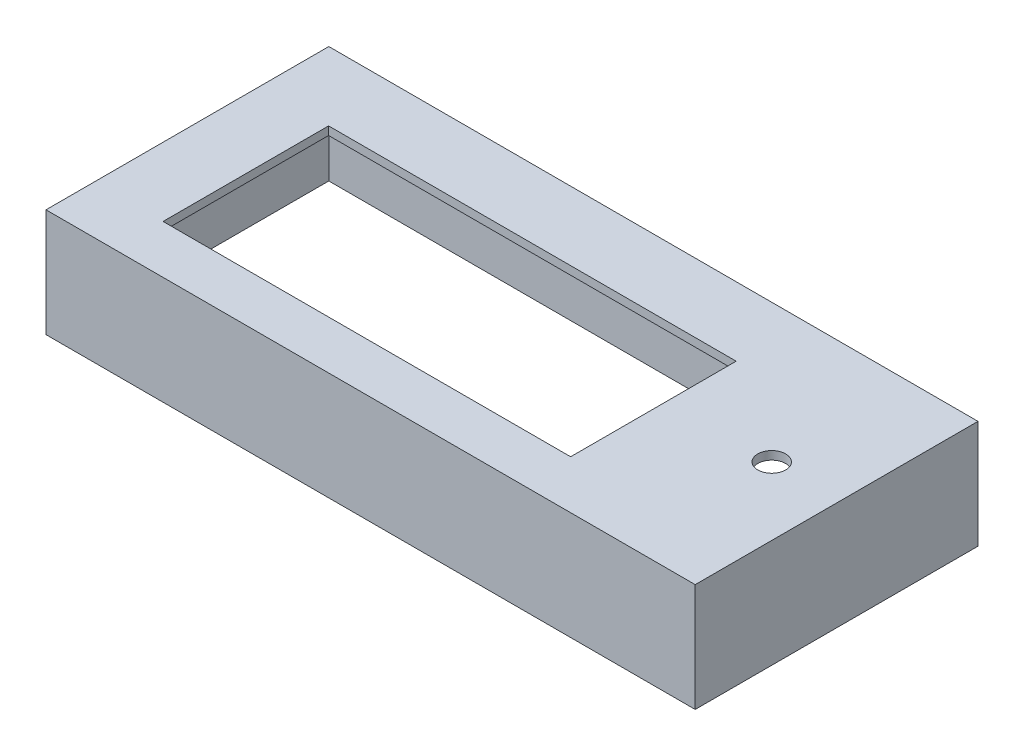
ISO-10303-21;
HEADER;
FILE_DESCRIPTION(('STEP AP214'),'2;1');
FILE_NAME('part.step','',(''),(''),'','','');
FILE_SCHEMA(('AUTOMOTIVE_DESIGN { 1 0 10303 214 1 1 1 1 }'));
ENDSEC;
DATA;
#1=APPLICATION_CONTEXT('core data for automotive mechanical design processes');
#2=APPLICATION_PROTOCOL_DEFINITION('international standard','automotive_design',2000,#1);
#3=PRODUCT_CONTEXT('',#1,'mechanical');
#4=PRODUCT('Part','Part','',(#3));
#5=PRODUCT_RELATED_PRODUCT_CATEGORY('part','',(#4));
#6=PRODUCT_DEFINITION_FORMATION('','',#4);
#7=PRODUCT_DEFINITION_CONTEXT('part definition',#1,'design');
#8=PRODUCT_DEFINITION('design','',#6,#7);
#9=PRODUCT_DEFINITION_SHAPE('','',#8);
#10=(LENGTH_UNIT() NAMED_UNIT(*) SI_UNIT(.MILLI.,.METRE.));
#11=(NAMED_UNIT(*) PLANE_ANGLE_UNIT() SI_UNIT($,.RADIAN.));
#12=(NAMED_UNIT(*) SI_UNIT($,.STERADIAN.) SOLID_ANGLE_UNIT());
#13=UNCERTAINTY_MEASURE_WITH_UNIT(LENGTH_MEASURE(1.E-05),#10,'distance_accuracy_value','');
#14=(GEOMETRIC_REPRESENTATION_CONTEXT(3) GLOBAL_UNCERTAINTY_ASSIGNED_CONTEXT((#13)) GLOBAL_UNIT_ASSIGNED_CONTEXT((#10,
#11,#12)) REPRESENTATION_CONTEXT('',''));
#15=CARTESIAN_POINT('',(0.,0.,0.));
#16=DIRECTION('',(0.,0.,1.));
#17=DIRECTION('',(1.,0.,0.));
#18=AXIS2_PLACEMENT_3D('',#15,#16,#17);
#19=CARTESIAN_POINT('',(78.05,2.,34.));
#20=DIRECTION('',(-1.,0.,0.));
#21=DIRECTION('',(0.,0.,1.));
#22=AXIS2_PLACEMENT_3D('',#19,#20,#21);
#23=PLANE('',#22);
#24=DIRECTION('',(0.,-1.,0.));
#25=VECTOR('',#24,1.);
#26=CARTESIAN_POINT('',(78.05,2.,34.));
#27=LINE('',#26,#25);
#28=CARTESIAN_POINT('',(78.05,2.,34.));
#29=VERTEX_POINT('',#28);
#30=CARTESIAN_POINT('',(78.05,-24.,34.));
#31=VERTEX_POINT('',#30);
#32=EDGE_CURVE('E205',#29,#31,#27,.T.);
#33=ORIENTED_EDGE('',*,*,#32,.T.);
#34=DIRECTION('',(0.,0.,1.));
#35=VECTOR('',#34,1.);
#36=CARTESIAN_POINT('',(78.05,-24.,-34.));
#37=LINE('',#36,#35);
#38=CARTESIAN_POINT('',(78.05,-24.,-34.));
#39=VERTEX_POINT('',#38);
#40=EDGE_CURVE('E163',#39,#31,#37,.T.);
#41=ORIENTED_EDGE('',*,*,#40,.F.);
#42=DIRECTION('',(0.,-1.,0.));
#43=VECTOR('',#42,1.);
#44=CARTESIAN_POINT('',(78.05,2.,-34.));
#45=LINE('',#44,#43);
#46=CARTESIAN_POINT('',(78.05,2.,-34.));
#47=VERTEX_POINT('',#46);
#48=EDGE_CURVE('E211',#47,#39,#45,.T.);
#49=ORIENTED_EDGE('',*,*,#48,.F.);
#50=DIRECTION('',(0.,0.,-1.));
#51=VECTOR('',#50,1.);
#52=CARTESIAN_POINT('',(78.05,2.,34.));
#53=LINE('',#52,#51);
#54=EDGE_CURVE('E196',#29,#47,#53,.T.);
#55=ORIENTED_EDGE('',*,*,#54,.F.);
#56=EDGE_LOOP('',(#33,#41,#49,#55));
#57=FACE_BOUND('',#56,.T.);
#58=ADVANCED_FACE('F37',(#57),#23,.F.);
#59=CARTESIAN_POINT('',(-78.05,2.,-34.));
#60=DIRECTION('',(0.,0.,1.));
#61=DIRECTION('',(1.,0.,0.));
#62=AXIS2_PLACEMENT_3D('',#59,#60,#61);
#63=PLANE('',#62);
#64=ORIENTED_EDGE('',*,*,#48,.T.);
#65=DIRECTION('',(1.,0.,0.));
#66=VECTOR('',#65,1.);
#67=CARTESIAN_POINT('',(-78.05,-24.,-34.));
#68=LINE('',#67,#66);
#69=CARTESIAN_POINT('',(-78.05,-24.,-34.));
#70=VERTEX_POINT('',#69);
#71=EDGE_CURVE('E139',#70,#39,#68,.T.);
#72=ORIENTED_EDGE('',*,*,#71,.F.);
#73=DIRECTION('',(0.,-1.,0.));
#74=VECTOR('',#73,1.);
#75=CARTESIAN_POINT('',(-78.05,2.,-34.));
#76=LINE('',#75,#74);
#77=CARTESIAN_POINT('',(-78.05,2.,-34.));
#78=VERTEX_POINT('',#77);
#79=EDGE_CURVE('E209',#78,#70,#76,.T.);
#80=ORIENTED_EDGE('',*,*,#79,.F.);
#81=DIRECTION('',(-1.,0.,0.));
#82=VECTOR('',#81,1.);
#83=CARTESIAN_POINT('',(-78.05,2.,-34.));
#84=LINE('',#83,#82);
#85=EDGE_CURVE('E199',#47,#78,#84,.T.);
#86=ORIENTED_EDGE('',*,*,#85,.F.);
#87=EDGE_LOOP('',(#64,#72,#80,#86));
#88=FACE_BOUND('',#87,.T.);
#89=ADVANCED_FACE('F254',(#88),#63,.F.);
#90=CARTESIAN_POINT('',(-78.05,2.,34.));
#91=DIRECTION('',(1.,0.,0.));
#92=DIRECTION('',(0.,0.,-1.));
#93=AXIS2_PLACEMENT_3D('',#90,#91,#92);
#94=PLANE('',#93);
#95=ORIENTED_EDGE('',*,*,#79,.T.);
#96=DIRECTION('',(0.,0.,-1.));
#97=VECTOR('',#96,1.);
#98=CARTESIAN_POINT('',(-78.05,-24.,34.));
#99=LINE('',#98,#97);
#100=CARTESIAN_POINT('',(-78.05,-24.,34.));
#101=VERTEX_POINT('',#100);
#102=EDGE_CURVE('E169',#101,#70,#99,.T.);
#103=ORIENTED_EDGE('',*,*,#102,.F.);
#104=DIRECTION('',(0.,-1.,0.));
#105=VECTOR('',#104,1.);
#106=CARTESIAN_POINT('',(-78.05,2.,34.));
#107=LINE('',#106,#105);
#108=CARTESIAN_POINT('',(-78.05,2.,34.));
#109=VERTEX_POINT('',#108);
#110=EDGE_CURVE('E207',#109,#101,#107,.T.);
#111=ORIENTED_EDGE('',*,*,#110,.F.);
#112=DIRECTION('',(0.,0.,1.));
#113=VECTOR('',#112,1.);
#114=CARTESIAN_POINT('',(-78.05,2.,34.));
#115=LINE('',#114,#113);
#116=EDGE_CURVE('E201',#78,#109,#115,.T.);
#117=ORIENTED_EDGE('',*,*,#116,.F.);
#118=EDGE_LOOP('',(#95,#103,#111,#117));
#119=FACE_BOUND('',#118,.T.);
#120=ADVANCED_FACE('F259',(#119),#94,.F.);
#121=CARTESIAN_POINT('',(-78.05,2.,34.));
#122=DIRECTION('',(0.,0.,-1.));
#123=DIRECTION('',(-1.,0.,0.));
#124=AXIS2_PLACEMENT_3D('',#121,#122,#123);
#125=PLANE('',#124);
#126=ORIENTED_EDGE('',*,*,#110,.T.);
#127=DIRECTION('',(-1.,0.,0.));
#128=VECTOR('',#127,1.);
#129=CARTESIAN_POINT('',(78.05,-24.,34.));
#130=LINE('',#129,#128);
#131=EDGE_CURVE('E166',#31,#101,#130,.T.);
#132=ORIENTED_EDGE('',*,*,#131,.F.);
#133=ORIENTED_EDGE('',*,*,#32,.F.);
#134=DIRECTION('',(1.,0.,0.));
#135=VECTOR('',#134,1.);
#136=CARTESIAN_POINT('',(-78.05,2.,34.));
#137=LINE('',#136,#135);
#138=EDGE_CURVE('E203',#109,#29,#137,.T.);
#139=ORIENTED_EDGE('',*,*,#138,.F.);
#140=EDGE_LOOP('',(#126,#132,#133,#139));
#141=FACE_BOUND('',#140,.T.);
#142=ADVANCED_FACE('F270',(#141),#125,.F.);
#143=CARTESIAN_POINT('',(0.,2.,0.));
#144=DIRECTION('',(0.,-1.,0.));
#145=DIRECTION('',(0.,0.,-1.));
#146=AXIS2_PLACEMENT_3D('',#143,#144,#145);
#147=PLANE('',#146);
#148=DIRECTION('',(1.,0.,0.));
#149=VECTOR('',#148,1.);
#150=CARTESIAN_POINT('',(0.,2.,22.35));
#151=LINE('',#150,#149);
#152=CARTESIAN_POINT('',(-61.55,2.,22.35));
#153=VERTEX_POINT('',#152);
#154=CARTESIAN_POINT('',(36.45,2.,22.35));
#155=VERTEX_POINT('',#154);
#156=EDGE_CURVE('E189',#153,#155,#151,.T.);
#157=ORIENTED_EDGE('',*,*,#156,.F.);
#158=DIRECTION('',(0.,0.,1.));
#159=VECTOR('',#158,1.);
#160=CARTESIAN_POINT('',(-61.55,2.,0.));
#161=LINE('',#160,#159);
#162=CARTESIAN_POINT('',(-61.55,2.,-17.45));
#163=VERTEX_POINT('',#162);
#164=EDGE_CURVE('E194',#163,#153,#161,.T.);
#165=ORIENTED_EDGE('',*,*,#164,.F.);
#166=DIRECTION('',(-1.,0.,0.));
#167=VECTOR('',#166,1.);
#168=CARTESIAN_POINT('',(0.,2.,-17.45));
#169=LINE('',#168,#167);
#170=CARTESIAN_POINT('',(36.45,2.,-17.45));
#171=VERTEX_POINT('',#170);
#172=EDGE_CURVE('E187',#171,#163,#169,.T.);
#173=ORIENTED_EDGE('',*,*,#172,.F.);
#174=DIRECTION('',(0.,0.,-1.));
#175=VECTOR('',#174,1.);
#176=CARTESIAN_POINT('',(36.45,2.,0.));
#177=LINE('',#176,#175);
#178=EDGE_CURVE('E191',#155,#171,#177,.T.);
#179=ORIENTED_EDGE('',*,*,#178,.F.);
#180=EDGE_LOOP('',(#157,#165,#173,#179));
#181=FACE_BOUND('',#180,.T.);
#182=CARTESIAN_POINT('',(61.7,2.,-0.749999999999999));
#183=DIRECTION('',(0.,-1.,0.));
#184=DIRECTION('',(0.,0.,-1.));
#185=AXIS2_PLACEMENT_3D('',#182,#183,#184);
#186=CIRCLE('',#185,3.34999999999999);
#187=CARTESIAN_POINT('',(61.7,2.,-4.09999999999999));
#188=VERTEX_POINT('',#187);
#189=EDGE_CURVE('E184',#188,#188,#186,.F.);
#190=ORIENTED_EDGE('',*,*,#189,.F.);
#191=EDGE_LOOP('',(#190));
#192=FACE_BOUND('',#191,.T.);
#193=ORIENTED_EDGE('',*,*,#54,.T.);
#194=ORIENTED_EDGE('',*,*,#85,.T.);
#195=ORIENTED_EDGE('',*,*,#116,.T.);
#196=ORIENTED_EDGE('',*,*,#138,.T.);
#197=EDGE_LOOP('',(#193,#194,#195,#196));
#198=FACE_BOUND('',#197,.T.);
#199=ADVANCED_FACE('F236',(#181,#192,#198),#147,.F.);
#200=CARTESIAN_POINT('',(0.,0.,0.));
#201=DIRECTION('',(0.,-1.,0.));
#202=DIRECTION('',(0.,0.,-1.));
#203=AXIS2_PLACEMENT_3D('',#200,#201,#202);
#204=PLANE('',#203);
#205=DIRECTION('',(1.,0.,0.));
#206=VECTOR('',#205,1.);
#207=CARTESIAN_POINT('',(-76.05,0.,-32.));
#208=LINE('',#207,#206);
#209=CARTESIAN_POINT('',(-76.05,0.,-32.));
#210=VERTEX_POINT('',#209);
#211=CARTESIAN_POINT('',(76.05,0.,-32.));
#212=VERTEX_POINT('',#211);
#213=EDGE_CURVE('E51',#210,#212,#208,.T.);
#214=ORIENTED_EDGE('',*,*,#213,.T.);
#215=DIRECTION('',(0.,0.,1.));
#216=VECTOR('',#215,1.);
#217=CARTESIAN_POINT('',(76.05,0.,-32.));
#218=LINE('',#217,#216);
#219=CARTESIAN_POINT('',(76.05,0.,32.));
#220=VERTEX_POINT('',#219);
#221=EDGE_CURVE('E55',#212,#220,#218,.T.);
#222=ORIENTED_EDGE('',*,*,#221,.T.);
#223=DIRECTION('',(-1.,0.,0.));
#224=VECTOR('',#223,1.);
#225=CARTESIAN_POINT('',(76.05,0.,32.));
#226=LINE('',#225,#224);
#227=CARTESIAN_POINT('',(-76.05,0.,32.));
#228=VERTEX_POINT('',#227);
#229=EDGE_CURVE('E153',#220,#228,#226,.T.);
#230=ORIENTED_EDGE('',*,*,#229,.T.);
#231=DIRECTION('',(0.,0.,-1.));
#232=VECTOR('',#231,1.);
#233=CARTESIAN_POINT('',(-76.05,0.,32.));
#234=LINE('',#233,#232);
#235=EDGE_CURVE('E134',#228,#210,#234,.T.);
#236=ORIENTED_EDGE('',*,*,#235,.T.);
#237=EDGE_LOOP('',(#214,#222,#230,#236));
#238=FACE_BOUND('',#237,.T.);
#239=DIRECTION('',(0.,0.,1.));
#240=VECTOR('',#239,1.);
#241=CARTESIAN_POINT('',(-61.55,0.,0.));
#242=LINE('',#241,#240);
#243=CARTESIAN_POINT('',(-61.55,0.,-17.45));
#244=VERTEX_POINT('',#243);
#245=CARTESIAN_POINT('',(-61.55,0.,22.35));
#246=VERTEX_POINT('',#245);
#247=EDGE_CURVE('E44',#244,#246,#242,.T.);
#248=ORIENTED_EDGE('',*,*,#247,.T.);
#249=DIRECTION('',(1.,0.,0.));
#250=VECTOR('',#249,1.);
#251=CARTESIAN_POINT('',(0.,0.,22.35));
#252=LINE('',#251,#250);
#253=CARTESIAN_POINT('',(36.45,0.,22.35));
#254=VERTEX_POINT('',#253);
#255=EDGE_CURVE('E11',#246,#254,#252,.T.);
#256=ORIENTED_EDGE('',*,*,#255,.T.);
#257=DIRECTION('',(0.,0.,-1.));
#258=VECTOR('',#257,1.);
#259=CARTESIAN_POINT('',(36.45,0.,0.));
#260=LINE('',#259,#258);
#261=CARTESIAN_POINT('',(36.45,0.,-17.45));
#262=VERTEX_POINT('',#261);
#263=EDGE_CURVE('E218',#254,#262,#260,.T.);
#264=ORIENTED_EDGE('',*,*,#263,.T.);
#265=DIRECTION('',(-1.,0.,0.));
#266=VECTOR('',#265,1.);
#267=CARTESIAN_POINT('',(0.,0.,-17.45));
#268=LINE('',#267,#266);
#269=EDGE_CURVE('E213',#262,#244,#268,.T.);
#270=ORIENTED_EDGE('',*,*,#269,.T.);
#271=EDGE_LOOP('',(#248,#256,#264,#270));
#272=FACE_BOUND('',#271,.T.);
#273=CARTESIAN_POINT('',(61.7,0.,-0.749999999999999));
#274=DIRECTION('',(0.,-1.,0.));
#275=DIRECTION('',(0.,0.,-1.));
#276=AXIS2_PLACEMENT_3D('',#273,#274,#275);
#277=CIRCLE('',#276,3.34999999999999);
#278=CARTESIAN_POINT('',(61.7,0.,-4.09999999999999));
#279=VERTEX_POINT('',#278);
#280=EDGE_CURVE('E183',#279,#279,#277,.F.);
#281=ORIENTED_EDGE('',*,*,#280,.T.);
#282=EDGE_LOOP('',(#281));
#283=FACE_BOUND('',#282,.T.);
#284=ADVANCED_FACE('F223',(#238,#272,#283),#204,.T.);
#285=CARTESIAN_POINT('',(61.7,4.8,-0.749999999999999));
#286=DIRECTION('',(0.,-1.,0.));
#287=DIRECTION('',(0.,0.,-1.));
#288=AXIS2_PLACEMENT_3D('',#285,#286,#287);
#289=CYLINDRICAL_SURFACE('',#288,3.34999999999999);
#290=CARTESIAN_POINT('',(61.7,0.,-4.09999999999999));
#291=CARTESIAN_POINT('',(61.7,0.0208333333333342,-4.09999999999999));
#292=CARTESIAN_POINT('',(61.7,0.0416666666666676,-4.09999999999999));
#293=CARTESIAN_POINT('',(61.7,0.0833333333333343,-4.09999999999999));
#294=CARTESIAN_POINT('',(61.7,0.104166666666668,-4.09999999999999));
#295=CARTESIAN_POINT('',(61.7,0.145833333333334,-4.09999999999999));
#296=CARTESIAN_POINT('',(61.7,0.166666666666668,-4.09999999999999));
#297=CARTESIAN_POINT('',(61.7,0.208333333333334,-4.09999999999999));
#298=CARTESIAN_POINT('',(61.7,0.229166666666668,-4.09999999999999));
#299=CARTESIAN_POINT('',(61.7,0.270833333333334,-4.09999999999999));
#300=CARTESIAN_POINT('',(61.7,0.291666666666668,-4.09999999999999));
#301=CARTESIAN_POINT('',(61.7,0.333333333333335,-4.09999999999999));
#302=CARTESIAN_POINT('',(61.7,0.354166666666668,-4.09999999999999));
#303=CARTESIAN_POINT('',(61.7,0.395833333333335,-4.09999999999999));
#304=CARTESIAN_POINT('',(61.7,0.416666666666668,-4.09999999999999));
#305=CARTESIAN_POINT('',(61.7,0.458333333333335,-4.09999999999999));
#306=CARTESIAN_POINT('',(61.7,0.479166666666668,-4.09999999999999));
#307=CARTESIAN_POINT('',(61.7,0.520833333333335,-4.09999999999999));
#308=CARTESIAN_POINT('',(61.7,0.541666666666668,-4.09999999999999));
#309=CARTESIAN_POINT('',(61.7,0.583333333333334,-4.09999999999999));
#310=CARTESIAN_POINT('',(61.7,0.604166666666667,-4.09999999999999));
#311=CARTESIAN_POINT('',(61.7,0.645833333333334,-4.09999999999999));
#312=CARTESIAN_POINT('',(61.7,0.666666666666667,-4.09999999999999));
#313=CARTESIAN_POINT('',(61.7,0.708333333333334,-4.09999999999999));
#314=CARTESIAN_POINT('',(61.7,0.729166666666667,-4.09999999999999));
#315=CARTESIAN_POINT('',(61.7,0.770833333333334,-4.09999999999999));
#316=CARTESIAN_POINT('',(61.7,0.791666666666667,-4.09999999999999));
#317=CARTESIAN_POINT('',(61.7,0.833333333333334,-4.09999999999999));
#318=CARTESIAN_POINT('',(61.7,0.854166666666667,-4.09999999999999));
#319=CARTESIAN_POINT('',(61.7,0.895833333333334,-4.09999999999999));
#320=CARTESIAN_POINT('',(61.7,0.916666666666667,-4.09999999999999));
#321=CARTESIAN_POINT('',(61.7,0.958333333333334,-4.09999999999999));
#322=CARTESIAN_POINT('',(61.7,0.979166666666667,-4.09999999999999));
#323=CARTESIAN_POINT('',(61.7,1.02083333333333,-4.09999999999999));
#324=CARTESIAN_POINT('',(61.7,1.04166666666667,-4.09999999999999));
#325=CARTESIAN_POINT('',(61.7,1.08333333333333,-4.09999999999999));
#326=CARTESIAN_POINT('',(61.7,1.10416666666667,-4.09999999999999));
#327=CARTESIAN_POINT('',(61.7,1.14583333333333,-4.09999999999999));
#328=CARTESIAN_POINT('',(61.7,1.16666666666667,-4.09999999999999));
#329=CARTESIAN_POINT('',(61.7,1.20833333333333,-4.09999999999999));
#330=CARTESIAN_POINT('',(61.7,1.22916666666667,-4.09999999999999));
#331=CARTESIAN_POINT('',(61.7,1.27083333333333,-4.09999999999999));
#332=CARTESIAN_POINT('',(61.7,1.29166666666667,-4.09999999999999));
#333=CARTESIAN_POINT('',(61.7,1.33333333333333,-4.09999999999999));
#334=CARTESIAN_POINT('',(61.7,1.35416666666667,-4.09999999999999));
#335=CARTESIAN_POINT('',(61.7,1.39583333333333,-4.09999999999999));
#336=CARTESIAN_POINT('',(61.7,1.41666666666667,-4.09999999999999));
#337=CARTESIAN_POINT('',(61.7,1.45833333333333,-4.09999999999999));
#338=CARTESIAN_POINT('',(61.7,1.47916666666667,-4.09999999999999));
#339=CARTESIAN_POINT('',(61.7,1.52083333333333,-4.09999999999999));
#340=CARTESIAN_POINT('',(61.7,1.54166666666667,-4.09999999999999));
#341=CARTESIAN_POINT('',(61.7,1.58333333333333,-4.09999999999999));
#342=CARTESIAN_POINT('',(61.7,1.60416666666667,-4.09999999999999));
#343=CARTESIAN_POINT('',(61.7,1.64583333333333,-4.09999999999999));
#344=CARTESIAN_POINT('',(61.7,1.66666666666667,-4.09999999999999));
#345=CARTESIAN_POINT('',(61.7,1.70833333333333,-4.09999999999999));
#346=CARTESIAN_POINT('',(61.7,1.72916666666667,-4.09999999999999));
#347=CARTESIAN_POINT('',(61.7,1.77083333333333,-4.09999999999999));
#348=CARTESIAN_POINT('',(61.7,1.79166666666667,-4.09999999999999));
#349=CARTESIAN_POINT('',(61.7,1.83333333333333,-4.09999999999999));
#350=CARTESIAN_POINT('',(61.7,1.85416666666667,-4.09999999999999));
#351=CARTESIAN_POINT('',(61.7,1.89583333333333,-4.09999999999999));
#352=CARTESIAN_POINT('',(61.7,1.91666666666667,-4.09999999999999));
#353=CARTESIAN_POINT('',(61.7,1.95833333333333,-4.09999999999999));
#354=CARTESIAN_POINT('',(61.7,1.97916666666667,-4.09999999999999));
#355=CARTESIAN_POINT('',(61.7,2.,-4.09999999999999));
#356=B_SPLINE_CURVE_WITH_KNOTS('',3,(#290,#291,#292,#293,#294,#295,#296,#297,#298,#299,#300,
#301,#302,#303,#304,#305,#306,#307,#308,#309,#310,#311,#312,#313,#314,#315,#316,#317,#318,#319,
#320,#321,#322,#323,#324,#325,#326,#327,#328,#329,#330,#331,#332,#333,#334,#335,#336,#337,#338,
#339,#340,#341,#342,#343,#344,#345,#346,#347,#348,#349,#350,#351,#352,#353,#354,#355),
.UNSPECIFIED.,.F.,.F.,(4,2,2,2,2,2,2,2,2,2,2,2,2,2,2,2,2,2,2,2,2,2,2,2,2,2,2,2,2,2,2,2,4),(0.,
0.0625000000000001,0.125,0.1875,0.25,0.3125,0.375,0.4375,0.5,0.5625,0.625,0.6875,0.75,0.8125,
0.875,0.9375,1.,1.0625,1.125,1.1875,1.25,1.3125,1.375,1.4375,1.5,1.5625,1.625,1.6875,1.75,
1.8125,1.875,1.9375,2.),.UNSPECIFIED.);
#357=EDGE_CURVE('BSEAM282',#279,#188,#356,.T.);
#358=ORIENTED_EDGE('',*,*,#280,.F.);
#359=ORIENTED_EDGE('',*,*,#189,.T.);
#360=ORIENTED_EDGE('',*,*,#357,.T.);
#361=ORIENTED_EDGE('',*,*,#357,.F.);
#362=EDGE_LOOP('',(#358,#360,#359,#361));
#363=FACE_BOUND('',#362,.T.);
#364=ADVANCED_FACE('F282',(#363),#289,.F.);
#365=CARTESIAN_POINT('',(-61.55,-5.,-27.55));
#366=DIRECTION('',(1.,0.,0.));
#367=DIRECTION('',(0.,0.,-1.));
#368=AXIS2_PLACEMENT_3D('',#365,#366,#367);
#369=PLANE('',#368);
#370=ORIENTED_EDGE('',*,*,#164,.T.);
#371=DIRECTION('',(0.,-1.,0.));
#372=VECTOR('',#371,1.);
#373=CARTESIAN_POINT('',(-61.55,5.,22.35));
#374=LINE('',#373,#372);
#375=EDGE_CURVE('E180',#153,#246,#374,.T.);
#376=ORIENTED_EDGE('',*,*,#375,.T.);
#377=ORIENTED_EDGE('',*,*,#247,.F.);
#378=DIRECTION('',(0.,-1.,0.));
#379=VECTOR('',#378,1.);
#380=CARTESIAN_POINT('',(-61.55,5.,-17.45));
#381=LINE('',#380,#379);
#382=EDGE_CURVE('E172',#163,#244,#381,.T.);
#383=ORIENTED_EDGE('',*,*,#382,.F.);
#384=EDGE_LOOP('',(#370,#376,#377,#383));
#385=FACE_BOUND('',#384,.T.);
#386=ADVANCED_FACE('F227',(#385),#369,.T.);
#387=CARTESIAN_POINT('',(36.45,-5.,-27.55));
#388=DIRECTION('',(-1.,0.,0.));
#389=DIRECTION('',(0.,0.,1.));
#390=AXIS2_PLACEMENT_3D('',#387,#388,#389);
#391=PLANE('',#390);
#392=ORIENTED_EDGE('',*,*,#178,.T.);
#393=DIRECTION('',(0.,-1.,0.));
#394=VECTOR('',#393,1.);
#395=CARTESIAN_POINT('',(36.45,5.,-17.45));
#396=LINE('',#395,#394);
#397=EDGE_CURVE('E174',#171,#262,#396,.T.);
#398=ORIENTED_EDGE('',*,*,#397,.T.);
#399=ORIENTED_EDGE('',*,*,#263,.F.);
#400=DIRECTION('',(0.,-1.,0.));
#401=VECTOR('',#400,1.);
#402=CARTESIAN_POINT('',(36.45,5.,22.35));
#403=LINE('',#402,#401);
#404=EDGE_CURVE('E177',#155,#254,#403,.T.);
#405=ORIENTED_EDGE('',*,*,#404,.F.);
#406=EDGE_LOOP('',(#392,#398,#399,#405));
#407=FACE_BOUND('',#406,.T.);
#408=ADVANCED_FACE('F240',(#407),#391,.T.);
#409=CARTESIAN_POINT('',(-61.55,5.,22.35));
#410=DIRECTION('',(0.,0.,-1.));
#411=DIRECTION('',(-1.,0.,0.));
#412=AXIS2_PLACEMENT_3D('',#409,#410,#411);
#413=PLANE('',#412);
#414=ORIENTED_EDGE('',*,*,#156,.T.);
#415=ORIENTED_EDGE('',*,*,#404,.T.);
#416=ORIENTED_EDGE('',*,*,#255,.F.);
#417=ORIENTED_EDGE('',*,*,#375,.F.);
#418=EDGE_LOOP('',(#414,#415,#416,#417));
#419=FACE_BOUND('',#418,.T.);
#420=ADVANCED_FACE('F232',(#419),#413,.T.);
#421=CARTESIAN_POINT('',(-61.55,5.,-17.45));
#422=DIRECTION('',(0.,0.,1.));
#423=DIRECTION('',(1.,0.,0.));
#424=AXIS2_PLACEMENT_3D('',#421,#422,#423);
#425=PLANE('',#424);
#426=ORIENTED_EDGE('',*,*,#172,.T.);
#427=ORIENTED_EDGE('',*,*,#382,.T.);
#428=ORIENTED_EDGE('',*,*,#269,.F.);
#429=ORIENTED_EDGE('',*,*,#397,.F.);
#430=EDGE_LOOP('',(#426,#427,#428,#429));
#431=FACE_BOUND('',#430,.T.);
#432=ADVANCED_FACE('F242',(#431),#425,.T.);
#433=CARTESIAN_POINT('',(0.,-24.,0.));
#434=DIRECTION('',(0.,-1.,0.));
#435=DIRECTION('',(0.,0.,-1.));
#436=AXIS2_PLACEMENT_3D('',#433,#434,#435);
#437=PLANE('',#436);
#438=ORIENTED_EDGE('',*,*,#71,.T.);
#439=ORIENTED_EDGE('',*,*,#40,.T.);
#440=ORIENTED_EDGE('',*,*,#131,.T.);
#441=ORIENTED_EDGE('',*,*,#102,.T.);
#442=EDGE_LOOP('',(#438,#439,#440,#441));
#443=FACE_BOUND('',#442,.T.);
#444=DIRECTION('',(0.,0.,1.));
#445=VECTOR('',#444,1.);
#446=CARTESIAN_POINT('',(76.05,-24.,-32.));
#447=LINE('',#446,#445);
#448=CARTESIAN_POINT('',(76.05,-24.,-32.));
#449=VERTEX_POINT('',#448);
#450=CARTESIAN_POINT('',(76.05,-24.,32.));
#451=VERTEX_POINT('',#450);
#452=EDGE_CURVE('E133',#449,#451,#447,.T.);
#453=ORIENTED_EDGE('',*,*,#452,.F.);
#454=DIRECTION('',(1.,0.,0.));
#455=VECTOR('',#454,1.);
#456=CARTESIAN_POINT('',(-76.05,-24.,-32.));
#457=LINE('',#456,#455);
#458=CARTESIAN_POINT('',(-76.05,-24.,-32.));
#459=VERTEX_POINT('',#458);
#460=EDGE_CURVE('E124',#459,#449,#457,.T.);
#461=ORIENTED_EDGE('',*,*,#460,.F.);
#462=DIRECTION('',(0.,0.,-1.));
#463=VECTOR('',#462,1.);
#464=CARTESIAN_POINT('',(-76.05,-24.,32.));
#465=LINE('',#464,#463);
#466=CARTESIAN_POINT('',(-76.05,-24.,32.));
#467=VERTEX_POINT('',#466);
#468=EDGE_CURVE('E147',#467,#459,#465,.T.);
#469=ORIENTED_EDGE('',*,*,#468,.F.);
#470=DIRECTION('',(-1.,0.,0.));
#471=VECTOR('',#470,1.);
#472=CARTESIAN_POINT('',(76.05,-24.,32.));
#473=LINE('',#472,#471);
#474=EDGE_CURVE('E145',#451,#467,#473,.T.);
#475=ORIENTED_EDGE('',*,*,#474,.F.);
#476=EDGE_LOOP('',(#453,#461,#469,#475));
#477=FACE_BOUND('',#476,.T.);
#478=ADVANCED_FACE('F143',(#443,#477),#437,.T.);
#479=CARTESIAN_POINT('',(-76.05,-24.,-32.));
#480=DIRECTION('',(0.,0.,1.));
#481=DIRECTION('',(1.,0.,0.));
#482=AXIS2_PLACEMENT_3D('',#479,#480,#481);
#483=PLANE('',#482);
#484=ORIENTED_EDGE('',*,*,#213,.F.);
#485=DIRECTION('',(0.,1.,0.));
#486=VECTOR('',#485,1.);
#487=CARTESIAN_POINT('',(-76.05,-24.,-32.));
#488=LINE('',#487,#486);
#489=EDGE_CURVE('E129',#459,#210,#488,.T.);
#490=ORIENTED_EDGE('',*,*,#489,.F.);
#491=ORIENTED_EDGE('',*,*,#460,.T.);
#492=DIRECTION('',(0.,1.,0.));
#493=VECTOR('',#492,1.);
#494=CARTESIAN_POINT('',(76.05,-24.,-32.));
#495=LINE('',#494,#493);
#496=EDGE_CURVE('E127',#449,#212,#495,.T.);
#497=ORIENTED_EDGE('',*,*,#496,.T.);
#498=EDGE_LOOP('',(#484,#490,#491,#497));
#499=FACE_BOUND('',#498,.T.);
#500=ADVANCED_FACE('F126',(#499),#483,.T.);
#501=CARTESIAN_POINT('',(76.05,-24.,-32.));
#502=DIRECTION('',(-1.,0.,0.));
#503=DIRECTION('',(0.,0.,1.));
#504=AXIS2_PLACEMENT_3D('',#501,#502,#503);
#505=PLANE('',#504);
#506=ORIENTED_EDGE('',*,*,#221,.F.);
#507=ORIENTED_EDGE('',*,*,#496,.F.);
#508=ORIENTED_EDGE('',*,*,#452,.T.);
#509=DIRECTION('',(0.,1.,0.));
#510=VECTOR('',#509,1.);
#511=CARTESIAN_POINT('',(76.05,-24.,32.));
#512=LINE('',#511,#510);
#513=EDGE_CURVE('E140',#451,#220,#512,.T.);
#514=ORIENTED_EDGE('',*,*,#513,.T.);
#515=EDGE_LOOP('',(#506,#507,#508,#514));
#516=FACE_BOUND('',#515,.T.);
#517=ADVANCED_FACE('F137',(#516),#505,.T.);
#518=CARTESIAN_POINT('',(76.05,-24.,32.));
#519=DIRECTION('',(0.,0.,-1.));
#520=DIRECTION('',(-1.,0.,0.));
#521=AXIS2_PLACEMENT_3D('',#518,#519,#520);
#522=PLANE('',#521);
#523=ORIENTED_EDGE('',*,*,#229,.F.);
#524=ORIENTED_EDGE('',*,*,#513,.F.);
#525=ORIENTED_EDGE('',*,*,#474,.T.);
#526=DIRECTION('',(0.,1.,0.));
#527=VECTOR('',#526,1.);
#528=CARTESIAN_POINT('',(-76.05,-24.,32.));
#529=LINE('',#528,#527);
#530=EDGE_CURVE('E157',#467,#228,#529,.T.);
#531=ORIENTED_EDGE('',*,*,#530,.T.);
#532=EDGE_LOOP('',(#523,#524,#525,#531));
#533=FACE_BOUND('',#532,.T.);
#534=ADVANCED_FACE('F331',(#533),#522,.T.);
#535=CARTESIAN_POINT('',(-76.05,-24.,32.));
#536=DIRECTION('',(1.,0.,0.));
#537=DIRECTION('',(0.,0.,-1.));
#538=AXIS2_PLACEMENT_3D('',#535,#536,#537);
#539=PLANE('',#538);
#540=ORIENTED_EDGE('',*,*,#235,.F.);
#541=ORIENTED_EDGE('',*,*,#530,.F.);
#542=ORIENTED_EDGE('',*,*,#468,.T.);
#543=ORIENTED_EDGE('',*,*,#489,.T.);
#544=EDGE_LOOP('',(#540,#541,#542,#543));
#545=FACE_BOUND('',#544,.T.);
#546=ADVANCED_FACE('F340',(#545),#539,.T.);
#547=CLOSED_SHELL('',(#58,#89,#120,#142,#199,#284,#364,#386,#408,#420,#432,#478,#500,#517,#534,#546));
#548=MANIFOLD_SOLID_BREP('B2',#547);
#549=ADVANCED_BREP_SHAPE_REPRESENTATION('',(#18,#548),#14);
#550=SHAPE_DEFINITION_REPRESENTATION(#9,#549);
ENDSEC;
END-ISO-10303-21;
